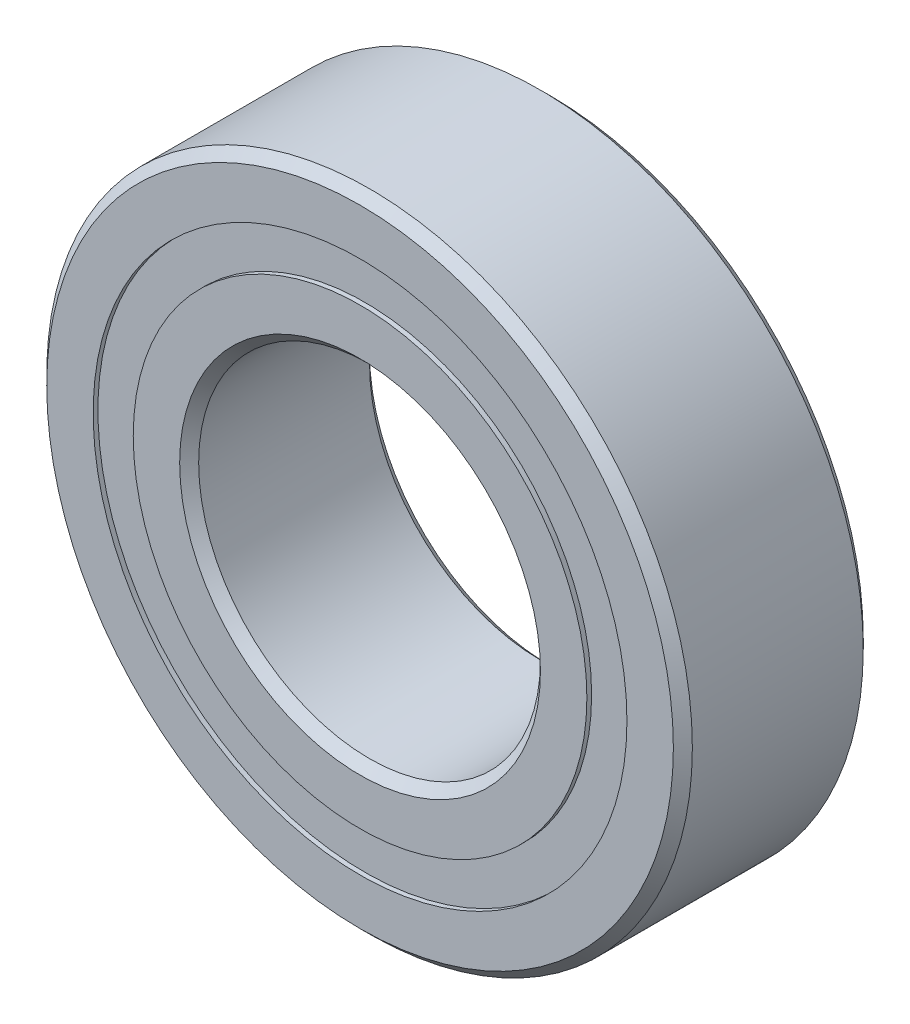
ISO-10303-21;
HEADER;
FILE_DESCRIPTION(('STEP AP214'),'2;1');
FILE_NAME('part.step','',(''),(''),'','','');
FILE_SCHEMA(('AUTOMOTIVE_DESIGN { 1 0 10303 214 1 1 1 1 }'));
ENDSEC;
DATA;
#1=APPLICATION_CONTEXT('core data for automotive mechanical design processes');
#2=APPLICATION_PROTOCOL_DEFINITION('international standard','automotive_design',2000,#1);
#3=PRODUCT_CONTEXT('',#1,'mechanical');
#4=PRODUCT('Part','Part','',(#3));
#5=PRODUCT_RELATED_PRODUCT_CATEGORY('part','',(#4));
#6=PRODUCT_DEFINITION_FORMATION('','',#4);
#7=PRODUCT_DEFINITION_CONTEXT('part definition',#1,'design');
#8=PRODUCT_DEFINITION('design','',#6,#7);
#9=PRODUCT_DEFINITION_SHAPE('','',#8);
#10=(LENGTH_UNIT() NAMED_UNIT(*) SI_UNIT(.MILLI.,.METRE.));
#11=(NAMED_UNIT(*) PLANE_ANGLE_UNIT() SI_UNIT($,.RADIAN.));
#12=(NAMED_UNIT(*) SI_UNIT($,.STERADIAN.) SOLID_ANGLE_UNIT());
#13=UNCERTAINTY_MEASURE_WITH_UNIT(LENGTH_MEASURE(1.E-05),#10,'distance_accuracy_value','');
#14=(GEOMETRIC_REPRESENTATION_CONTEXT(3) GLOBAL_UNCERTAINTY_ASSIGNED_CONTEXT((#13)) GLOBAL_UNIT_ASSIGNED_CONTEXT((#10,
#11,#12)) REPRESENTATION_CONTEXT('',''));
#15=CARTESIAN_POINT('',(0.,0.,0.));
#16=DIRECTION('',(0.,0.,1.));
#17=DIRECTION('',(1.,0.,0.));
#18=AXIS2_PLACEMENT_3D('',#15,#16,#17);
#19=CARTESIAN_POINT('',(0.,7.02747252747253,-2.375));
#20=DIRECTION('',(0.,0.,1.));
#21=DIRECTION('',(1.,0.,0.));
#22=AXIS2_PLACEMENT_3D('',#19,#20,#21);
#23=PLANE('',#22);
#24=CARTESIAN_POINT('',(0.,0.,-2.375));
#25=DIRECTION('',(0.,0.,1.));
#26=DIRECTION('',(1.,0.,0.));
#27=AXIS2_PLACEMENT_3D('',#24,#25,#26);
#28=CIRCLE('',#27,7.02747252747253);
#29=CARTESIAN_POINT('',(7.02747252747253,0.,-2.375));
#30=VERTEX_POINT('',#29);
#31=EDGE_CURVE('E59',#30,#30,#28,.T.);
#32=ORIENTED_EDGE('',*,*,#31,.F.);
#33=EDGE_LOOP('',(#32));
#34=FACE_BOUND('',#33,.T.);
#35=CARTESIAN_POINT('',(0.,0.,-2.375));
#36=DIRECTION('',(0.,0.,1.));
#37=DIRECTION('',(1.,0.,0.));
#38=AXIS2_PLACEMENT_3D('',#35,#36,#37);
#39=CIRCLE('',#38,5.97252747252748);
#40=CARTESIAN_POINT('',(5.97252747252748,0.,-2.375));
#41=VERTEX_POINT('',#40);
#42=EDGE_CURVE('E11',#41,#41,#39,.T.);
#43=ORIENTED_EDGE('',*,*,#42,.T.);
#44=EDGE_LOOP('',(#43));
#45=FACE_BOUND('',#44,.T.);
#46=ADVANCED_FACE('F45',(#34,#45),#23,.F.);
#47=CARTESIAN_POINT('',(0.,0.,2.5));
#48=DIRECTION('',(0.,0.,1.));
#49=DIRECTION('',(1.,0.,0.));
#50=AXIS2_PLACEMENT_3D('',#47,#48,#49);
#51=CYLINDRICAL_SURFACE('',#50,5.97252747252747);
#52=ORIENTED_EDGE('',*,*,#42,.F.);
#53=EDGE_LOOP('',(#52));
#54=FACE_BOUND('',#53,.T.);
#55=CARTESIAN_POINT('',(0.,0.,-1.22995738481983));
#56=DIRECTION('',(0.,0.,1.));
#57=DIRECTION('',(1.,0.,0.));
#58=AXIS2_PLACEMENT_3D('',#55,#56,#57);
#59=CIRCLE('',#58,5.97252747252747);
#60=CARTESIAN_POINT('',(5.97252747252747,0.,-1.22995738481983));
#61=VERTEX_POINT('',#60);
#62=EDGE_CURVE('E51',#61,#61,#59,.T.);
#63=ORIENTED_EDGE('',*,*,#62,.T.);
#64=EDGE_LOOP('',(#63));
#65=FACE_BOUND('',#64,.T.);
#66=ADVANCED_FACE('F68',(#54,#65),#51,.F.);
#67=CARTESIAN_POINT('',(0.,7.02747252747253,-1.22995738481983));
#68=DIRECTION('',(0.,0.,-1.));
#69=DIRECTION('',(-1.,0.,0.));
#70=AXIS2_PLACEMENT_3D('',#67,#68,#69);
#71=PLANE('',#70);
#72=ORIENTED_EDGE('',*,*,#62,.F.);
#73=EDGE_LOOP('',(#72));
#74=FACE_BOUND('',#73,.T.);
#75=CARTESIAN_POINT('',(0.,0.,-1.22995738481983));
#76=DIRECTION('',(0.,0.,1.));
#77=DIRECTION('',(1.,0.,0.));
#78=AXIS2_PLACEMENT_3D('',#75,#76,#77);
#79=CIRCLE('',#78,7.02747252747253);
#80=CARTESIAN_POINT('',(7.02747252747253,0.,-1.22995738481983));
#81=VERTEX_POINT('',#80);
#82=EDGE_CURVE('E55',#81,#81,#79,.T.);
#83=ORIENTED_EDGE('',*,*,#82,.T.);
#84=EDGE_LOOP('',(#83));
#85=FACE_BOUND('',#84,.T.);
#86=ADVANCED_FACE('F72',(#74,#85),#71,.F.);
#87=CARTESIAN_POINT('',(0.,0.,2.5));
#88=DIRECTION('',(0.,0.,1.));
#89=DIRECTION('',(1.,0.,0.));
#90=AXIS2_PLACEMENT_3D('',#87,#88,#89);
#91=CYLINDRICAL_SURFACE('',#90,7.02747252747253);
#92=ORIENTED_EDGE('',*,*,#82,.F.);
#93=EDGE_LOOP('',(#92));
#94=FACE_BOUND('',#93,.T.);
#95=ORIENTED_EDGE('',*,*,#31,.T.);
#96=EDGE_LOOP('',(#95));
#97=FACE_BOUND('',#96,.T.);
#98=ADVANCED_FACE('F65',(#94,#97),#91,.T.);
#99=CLOSED_SHELL('',(#46,#66,#86,#98));
#100=MANIFOLD_SOLID_BREP('B2',#99);
#101=CARTESIAN_POINT('',(0.,7.02747252747253,2.375));
#102=DIRECTION('',(0.,0.,-1.));
#103=DIRECTION('',(-1.,0.,0.));
#104=AXIS2_PLACEMENT_3D('',#101,#102,#103);
#105=PLANE('',#104);
#106=CARTESIAN_POINT('',(0.,0.,2.375));
#107=DIRECTION('',(0.,0.,1.));
#108=DIRECTION('',(1.,0.,0.));
#109=AXIS2_PLACEMENT_3D('',#106,#107,#108);
#110=CIRCLE('',#109,5.97252747252747);
#111=CARTESIAN_POINT('',(5.97252747252747,0.,2.375));
#112=VERTEX_POINT('',#111);
#113=EDGE_CURVE('E44',#112,#112,#110,.T.);
#114=ORIENTED_EDGE('',*,*,#113,.F.);
#115=EDGE_LOOP('',(#114));
#116=FACE_BOUND('',#115,.T.);
#117=CARTESIAN_POINT('',(0.,0.,2.375));
#118=DIRECTION('',(0.,0.,1.));
#119=DIRECTION('',(1.,0.,0.));
#120=AXIS2_PLACEMENT_3D('',#117,#118,#119);
#121=CIRCLE('',#120,7.02747252747253);
#122=CARTESIAN_POINT('',(7.02747252747253,0.,2.375));
#123=VERTEX_POINT('',#122);
#124=EDGE_CURVE('E134',#123,#123,#121,.T.);
#125=ORIENTED_EDGE('',*,*,#124,.T.);
#126=EDGE_LOOP('',(#125));
#127=FACE_BOUND('',#126,.T.);
#128=ADVANCED_FACE('F120',(#116,#127),#105,.F.);
#129=CARTESIAN_POINT('',(0.,0.,2.5));
#130=DIRECTION('',(0.,0.,1.));
#131=DIRECTION('',(1.,0.,0.));
#132=AXIS2_PLACEMENT_3D('',#129,#130,#131);
#133=CYLINDRICAL_SURFACE('',#132,5.97252747252747);
#134=CARTESIAN_POINT('',(0.,0.,1.22995738481983));
#135=DIRECTION('',(0.,0.,1.));
#136=DIRECTION('',(1.,0.,0.));
#137=AXIS2_PLACEMENT_3D('',#134,#135,#136);
#138=CIRCLE('',#137,5.97252747252747);
#139=CARTESIAN_POINT('',(5.97252747252747,0.,1.22995738481983));
#140=VERTEX_POINT('',#139);
#141=EDGE_CURVE('E126',#140,#140,#138,.T.);
#142=ORIENTED_EDGE('',*,*,#141,.F.);
#143=EDGE_LOOP('',(#142));
#144=FACE_BOUND('',#143,.T.);
#145=ORIENTED_EDGE('',*,*,#113,.T.);
#146=EDGE_LOOP('',(#145));
#147=FACE_BOUND('',#146,.T.);
#148=ADVANCED_FACE('F149',(#144,#147),#133,.F.);
#149=CARTESIAN_POINT('',(0.,7.02747252747253,1.22995738481983));
#150=DIRECTION('',(0.,0.,1.));
#151=DIRECTION('',(1.,0.,0.));
#152=AXIS2_PLACEMENT_3D('',#149,#150,#151);
#153=PLANE('',#152);
#154=CARTESIAN_POINT('',(0.,0.,1.22995738481983));
#155=DIRECTION('',(0.,0.,1.));
#156=DIRECTION('',(1.,0.,0.));
#157=AXIS2_PLACEMENT_3D('',#154,#155,#156);
#158=CIRCLE('',#157,7.02747252747253);
#159=CARTESIAN_POINT('',(7.02747252747253,0.,1.22995738481983));
#160=VERTEX_POINT('',#159);
#161=EDGE_CURVE('E130',#160,#160,#158,.T.);
#162=ORIENTED_EDGE('',*,*,#161,.F.);
#163=EDGE_LOOP('',(#162));
#164=FACE_BOUND('',#163,.T.);
#165=ORIENTED_EDGE('',*,*,#141,.T.);
#166=EDGE_LOOP('',(#165));
#167=FACE_BOUND('',#166,.T.);
#168=ADVANCED_FACE('F144',(#164,#167),#153,.F.);
#169=CARTESIAN_POINT('',(0.,0.,2.5));
#170=DIRECTION('',(0.,0.,1.));
#171=DIRECTION('',(1.,0.,0.));
#172=AXIS2_PLACEMENT_3D('',#169,#170,#171);
#173=CYLINDRICAL_SURFACE('',#172,7.02747252747253);
#174=ORIENTED_EDGE('',*,*,#124,.F.);
#175=EDGE_LOOP('',(#174));
#176=FACE_BOUND('',#175,.T.);
#177=ORIENTED_EDGE('',*,*,#161,.T.);
#178=EDGE_LOOP('',(#177));
#179=FACE_BOUND('',#178,.T.);
#180=ADVANCED_FACE('F141',(#176,#179),#173,.T.);
#181=CLOSED_SHELL('',(#128,#148,#168,#180));
#182=MANIFOLD_SOLID_BREP('B6',#181);
#183=CARTESIAN_POINT('',(-3.24999999999993,5.62916512459889,0.));
#184=DIRECTION('',(0.,0.,1.));
#185=DIRECTION('',(-0.499999999999989,0.866025403784445,0.));
#186=AXIS2_PLACEMENT_3D('',#183,#184,#185);
#187=SPHERICAL_SURFACE('',#186,1.22995738481983);
#188=CARTESIAN_POINT('',(-3.24999999999993,5.62916512459889,1.22995738481983));
#189=VERTEX_POINT('',#188);
#190=VERTEX_LOOP('',#189);
#191=FACE_BOUND('',#190,.T.);
#192=ADVANCED_FACE('F195',(#191),#187,.T.);
#193=CLOSED_SHELL('',(#192));
#194=MANIFOLD_SOLID_BREP('B39',#193);
#195=CARTESIAN_POINT('',(-5.62916512459881,3.25000000000007,0.));
#196=DIRECTION('',(0.,0.,1.));
#197=DIRECTION('',(-0.866025403784433,0.50000000000001,0.));
#198=AXIS2_PLACEMENT_3D('',#195,#196,#197);
#199=SPHERICAL_SURFACE('',#198,1.22995738481983);
#200=CARTESIAN_POINT('',(-5.62916512459881,3.25000000000007,1.22995738481983));
#201=VERTEX_POINT('',#200);
#202=VERTEX_LOOP('',#201);
#203=FACE_BOUND('',#202,.T.);
#204=ADVANCED_FACE('F217',(#203),#199,.T.);
#205=CLOSED_SHELL('',(#204));
#206=MANIFOLD_SOLID_BREP('B116',#205);
#207=CARTESIAN_POINT('',(-6.5,0.,0.));
#208=DIRECTION('',(0.,0.,1.));
#209=DIRECTION('',(-1.,0.,0.));
#210=AXIS2_PLACEMENT_3D('',#207,#208,#209);
#211=SPHERICAL_SURFACE('',#210,1.22995738481983);
#212=CARTESIAN_POINT('',(-6.5,0.,1.22995738481983));
#213=VERTEX_POINT('',#212);
#214=VERTEX_LOOP('',#213);
#215=FACE_BOUND('',#214,.T.);
#216=ADVANCED_FACE('F239',(#215),#211,.T.);
#217=CLOSED_SHELL('',(#216));
#218=MANIFOLD_SOLID_BREP('B191',#217);
#219=CARTESIAN_POINT('',(-5.62916512459888,-3.24999999999995,0.));
#220=DIRECTION('',(0.,0.,1.));
#221=DIRECTION('',(-0.866025403784443,-0.499999999999992,0.));
#222=AXIS2_PLACEMENT_3D('',#219,#220,#221);
#223=SPHERICAL_SURFACE('',#222,1.22995738481983);
#224=CARTESIAN_POINT('',(-5.62916512459888,-3.24999999999995,1.22995738481983));
#225=VERTEX_POINT('',#224);
#226=VERTEX_LOOP('',#225);
#227=FACE_BOUND('',#226,.T.);
#228=ADVANCED_FACE('F261',(#227),#223,.T.);
#229=CLOSED_SHELL('',(#228));
#230=MANIFOLD_SOLID_BREP('B213',#229);
#231=CARTESIAN_POINT('',(-3.25000000000005,-5.62916512459883,0.));
#232=DIRECTION('',(0.,0.,1.));
#233=DIRECTION('',(-0.500000000000007,-0.866025403784435,0.));
#234=AXIS2_PLACEMENT_3D('',#231,#232,#233);
#235=SPHERICAL_SURFACE('',#234,1.22995738481983);
#236=CARTESIAN_POINT('',(-3.25000000000005,-5.62916512459883,1.22995738481983));
#237=VERTEX_POINT('',#236);
#238=VERTEX_LOOP('',#237);
#239=FACE_BOUND('',#238,.T.);
#240=ADVANCED_FACE('F283',(#239),#235,.T.);
#241=CLOSED_SHELL('',(#240));
#242=MANIFOLD_SOLID_BREP('B235',#241);
#243=CARTESIAN_POINT('',(0.,-6.5,0.));
#244=DIRECTION('',(0.,0.,1.));
#245=DIRECTION('',(0.,-1.,0.));
#246=AXIS2_PLACEMENT_3D('',#243,#244,#245);
#247=SPHERICAL_SURFACE('',#246,1.22995738481983);
#248=CARTESIAN_POINT('',(0.,-6.5,1.22995738481983));
#249=VERTEX_POINT('',#248);
#250=VERTEX_LOOP('',#249);
#251=FACE_BOUND('',#250,.T.);
#252=ADVANCED_FACE('F305',(#251),#247,.T.);
#253=CLOSED_SHELL('',(#252));
#254=MANIFOLD_SOLID_BREP('B257',#253);
#255=CARTESIAN_POINT('',(3.24999999999997,-5.62916512459887,0.));
#256=DIRECTION('',(0.,0.,1.));
#257=DIRECTION('',(0.499999999999995,-0.866025403784442,0.));
#258=AXIS2_PLACEMENT_3D('',#255,#256,#257);
#259=SPHERICAL_SURFACE('',#258,1.22995738481983);
#260=CARTESIAN_POINT('',(3.24999999999997,-5.62916512459887,1.22995738481983));
#261=VERTEX_POINT('',#260);
#262=VERTEX_LOOP('',#261);
#263=FACE_BOUND('',#262,.T.);
#264=ADVANCED_FACE('F327',(#263),#259,.T.);
#265=CLOSED_SHELL('',(#264));
#266=MANIFOLD_SOLID_BREP('B279',#265);
#267=CARTESIAN_POINT('',(5.62916512459884,-3.25000000000003,0.));
#268=DIRECTION('',(0.,0.,1.));
#269=DIRECTION('',(0.866025403784436,-0.500000000000004,0.));
#270=AXIS2_PLACEMENT_3D('',#267,#268,#269);
#271=SPHERICAL_SURFACE('',#270,1.22995738481983);
#272=CARTESIAN_POINT('',(5.62916512459884,-3.25000000000003,1.22995738481983));
#273=VERTEX_POINT('',#272);
#274=VERTEX_LOOP('',#273);
#275=FACE_BOUND('',#274,.T.);
#276=ADVANCED_FACE('F349',(#275),#271,.T.);
#277=CLOSED_SHELL('',(#276));
#278=MANIFOLD_SOLID_BREP('B301',#277);
#279=CARTESIAN_POINT('',(6.5,0.,0.));
#280=DIRECTION('',(0.,0.,1.));
#281=DIRECTION('',(1.,0.,0.));
#282=AXIS2_PLACEMENT_3D('',#279,#280,#281);
#283=SPHERICAL_SURFACE('',#282,1.22995738481983);
#284=CARTESIAN_POINT('',(6.5,0.,1.22995738481983));
#285=VERTEX_POINT('',#284);
#286=VERTEX_LOOP('',#285);
#287=FACE_BOUND('',#286,.T.);
#288=ADVANCED_FACE('F371',(#287),#283,.T.);
#289=CLOSED_SHELL('',(#288));
#290=MANIFOLD_SOLID_BREP('B323',#289);
#291=CARTESIAN_POINT('',(5.62916512459886,3.24999999999999,0.));
#292=DIRECTION('',(0.,0.,1.));
#293=DIRECTION('',(0.86602540378444,0.499999999999998,0.));
#294=AXIS2_PLACEMENT_3D('',#291,#292,#293);
#295=SPHERICAL_SURFACE('',#294,1.22995738481983);
#296=CARTESIAN_POINT('',(5.62916512459886,3.24999999999999,1.22995738481983));
#297=VERTEX_POINT('',#296);
#298=VERTEX_LOOP('',#297);
#299=FACE_BOUND('',#298,.T.);
#300=ADVANCED_FACE('F393',(#299),#295,.T.);
#301=CLOSED_SHELL('',(#300));
#302=MANIFOLD_SOLID_BREP('B345',#301);
#303=CARTESIAN_POINT('',(3.25000000000001,5.62916512459885,0.));
#304=DIRECTION('',(0.,0.,1.));
#305=DIRECTION('',(0.500000000000001,0.866025403784438,0.));
#306=AXIS2_PLACEMENT_3D('',#303,#304,#305);
#307=SPHERICAL_SURFACE('',#306,1.22995738481983);
#308=CARTESIAN_POINT('',(3.25000000000001,5.62916512459885,1.22995738481983));
#309=VERTEX_POINT('',#308);
#310=VERTEX_LOOP('',#309);
#311=FACE_BOUND('',#310,.T.);
#312=ADVANCED_FACE('F415',(#311),#307,.T.);
#313=CLOSED_SHELL('',(#312));
#314=MANIFOLD_SOLID_BREP('B367',#313);
#315=CARTESIAN_POINT('',(0.,6.5,0.));
#316=DIRECTION('',(0.,0.,1.));
#317=DIRECTION('',(0.,1.,0.));
#318=AXIS2_PLACEMENT_3D('',#315,#316,#317);
#319=SPHERICAL_SURFACE('',#318,1.22995738481983);
#320=CARTESIAN_POINT('',(0.,6.5,1.22995738481983));
#321=VERTEX_POINT('',#320);
#322=VERTEX_LOOP('',#321);
#323=FACE_BOUND('',#322,.T.);
#324=ADVANCED_FACE('F439',(#323),#319,.T.);
#325=CLOSED_SHELL('',(#324));
#326=MANIFOLD_SOLID_BREP('B389',#325);
#327=CARTESIAN_POINT('',(0.,5.97252747252747,2.5));
#328=DIRECTION('',(0.,0.,-1.));
#329=DIRECTION('',(-1.,0.,0.));
#330=AXIS2_PLACEMENT_3D('',#327,#328,#329);
#331=PLANE('',#330);
#332=CARTESIAN_POINT('',(0.,0.,2.5));
#333=DIRECTION('',(0.,0.,1.));
#334=DIRECTION('',(1.,0.,0.));
#335=AXIS2_PLACEMENT_3D('',#332,#333,#334);
#336=CIRCLE('',#335,4.75);
#337=CARTESIAN_POINT('',(4.75,0.,2.5));
#338=VERTEX_POINT('',#337);
#339=EDGE_CURVE('E488',#338,#338,#336,.T.);
#340=ORIENTED_EDGE('',*,*,#339,.F.);
#341=EDGE_LOOP('',(#340));
#342=FACE_BOUND('',#341,.T.);
#343=CARTESIAN_POINT('',(0.,0.,2.5));
#344=DIRECTION('',(0.,0.,1.));
#345=DIRECTION('',(1.,0.,0.));
#346=AXIS2_PLACEMENT_3D('',#343,#344,#345);
#347=CIRCLE('',#346,5.97252747252747);
#348=CARTESIAN_POINT('',(5.97252747252747,0.,2.5));
#349=VERTEX_POINT('',#348);
#350=EDGE_CURVE('E438',#349,#349,#347,.T.);
#351=ORIENTED_EDGE('',*,*,#350,.T.);
#352=EDGE_LOOP('',(#351));
#353=FACE_BOUND('',#352,.T.);
#354=ADVANCED_FACE('F460',(#342,#353),#331,.F.);
#355=CARTESIAN_POINT('',(0.,0.,2.5));
#356=DIRECTION('',(0.,0.,1.));
#357=DIRECTION('',(1.,0.,0.));
#358=AXIS2_PLACEMENT_3D('',#355,#356,#357);
#359=CYLINDRICAL_SURFACE('',#358,5.97252747252747);
#360=ORIENTED_EDGE('',*,*,#350,.F.);
#361=EDGE_LOOP('',(#360));
#362=FACE_BOUND('',#361,.T.);
#363=CARTESIAN_POINT('',(0.,0.,1.11111111111111));
#364=DIRECTION('',(0.,0.,1.));
#365=DIRECTION('',(1.,0.,0.));
#366=AXIS2_PLACEMENT_3D('',#363,#364,#365);
#367=CIRCLE('',#366,5.97252747252747);
#368=CARTESIAN_POINT('',(5.97252747252747,0.,1.11111111111111));
#369=VERTEX_POINT('',#368);
#370=EDGE_CURVE('E466',#369,#369,#367,.T.);
#371=ORIENTED_EDGE('',*,*,#370,.T.);
#372=EDGE_LOOP('',(#371));
#373=FACE_BOUND('',#372,.T.);
#374=ADVANCED_FACE('F495',(#362,#373),#359,.T.);
#375=CARTESIAN_POINT('',(0.,0.,0.));
#376=DIRECTION('',(0.,0.,1.));
#377=DIRECTION('',(1.,0.,0.));
#378=AXIS2_PLACEMENT_3D('',#375,#376,#377);
#379=TOROIDAL_SURFACE('',#378,6.5,1.22995738481982);
#380=ORIENTED_EDGE('',*,*,#370,.F.);
#381=EDGE_LOOP('',(#380));
#382=FACE_BOUND('',#381,.T.);
#383=CARTESIAN_POINT('',(0.,0.,-1.11111111111111));
#384=DIRECTION('',(0.,0.,1.));
#385=DIRECTION('',(1.,0.,0.));
#386=AXIS2_PLACEMENT_3D('',#383,#384,#385);
#387=CIRCLE('',#386,5.97252747252747);
#388=CARTESIAN_POINT('',(5.97252747252747,0.,-1.11111111111111));
#389=VERTEX_POINT('',#388);
#390=EDGE_CURVE('E470',#389,#389,#387,.T.);
#391=ORIENTED_EDGE('',*,*,#390,.T.);
#392=EDGE_LOOP('',(#391));
#393=FACE_BOUND('',#392,.T.);
#394=ADVANCED_FACE('F499',(#382,#393),#379,.F.);
#395=CARTESIAN_POINT('',(0.,0.,2.5));
#396=DIRECTION('',(0.,0.,1.));
#397=DIRECTION('',(1.,0.,0.));
#398=AXIS2_PLACEMENT_3D('',#395,#396,#397);
#399=CYLINDRICAL_SURFACE('',#398,5.97252747252747);
#400=ORIENTED_EDGE('',*,*,#390,.F.);
#401=EDGE_LOOP('',(#400));
#402=FACE_BOUND('',#401,.T.);
#403=CARTESIAN_POINT('',(0.,0.,-2.5));
#404=DIRECTION('',(0.,0.,1.));
#405=DIRECTION('',(1.,0.,0.));
#406=AXIS2_PLACEMENT_3D('',#403,#404,#405);
#407=CIRCLE('',#406,5.97252747252747);
#408=CARTESIAN_POINT('',(5.97252747252747,0.,-2.5));
#409=VERTEX_POINT('',#408);
#410=EDGE_CURVE('E474',#409,#409,#407,.T.);
#411=ORIENTED_EDGE('',*,*,#410,.T.);
#412=EDGE_LOOP('',(#411));
#413=FACE_BOUND('',#412,.T.);
#414=ADVANCED_FACE('F504',(#402,#413),#399,.T.);
#415=CARTESIAN_POINT('',(0.,4.75,-2.5));
#416=DIRECTION('',(0.,0.,1.));
#417=DIRECTION('',(1.,0.,0.));
#418=AXIS2_PLACEMENT_3D('',#415,#416,#417);
#419=PLANE('',#418);
#420=ORIENTED_EDGE('',*,*,#410,.F.);
#421=EDGE_LOOP('',(#420));
#422=FACE_BOUND('',#421,.T.);
#423=CARTESIAN_POINT('',(0.,0.,-2.5));
#424=DIRECTION('',(0.,0.,1.));
#425=DIRECTION('',(1.,0.,0.));
#426=AXIS2_PLACEMENT_3D('',#423,#424,#425);
#427=CIRCLE('',#426,4.75);
#428=CARTESIAN_POINT('',(4.75,0.,-2.5));
#429=VERTEX_POINT('',#428);
#430=EDGE_CURVE('E479',#429,#429,#427,.T.);
#431=ORIENTED_EDGE('',*,*,#430,.T.);
#432=EDGE_LOOP('',(#431));
#433=FACE_BOUND('',#432,.T.);
#434=ADVANCED_FACE('F510',(#422,#433),#419,.F.);
#435=CARTESIAN_POINT('',(0.,0.,-2.25));
#436=DIRECTION('',(0.,0.,-1.));
#437=DIRECTION('',(-1.,0.,0.));
#438=AXIS2_PLACEMENT_3D('',#435,#436,#437);
#439=CONICAL_SURFACE('',#438,4.5,0.785398163397445);
#440=ORIENTED_EDGE('',*,*,#430,.F.);
#441=EDGE_LOOP('',(#440));
#442=FACE_BOUND('',#441,.T.);
#443=CARTESIAN_POINT('',(0.,0.,-2.25));
#444=DIRECTION('',(0.,0.,1.));
#445=DIRECTION('',(1.,0.,0.));
#446=AXIS2_PLACEMENT_3D('',#443,#444,#445);
#447=CIRCLE('',#446,4.5);
#448=CARTESIAN_POINT('',(4.5,0.,-2.25));
#449=VERTEX_POINT('',#448);
#450=EDGE_CURVE('E482',#449,#449,#447,.T.);
#451=ORIENTED_EDGE('',*,*,#450,.T.);
#452=EDGE_LOOP('',(#451));
#453=FACE_BOUND('',#452,.T.);
#454=ADVANCED_FACE('F514',(#442,#453),#439,.F.);
#455=CARTESIAN_POINT('',(0.,0.,2.5));
#456=DIRECTION('',(0.,0.,1.));
#457=DIRECTION('',(1.,0.,0.));
#458=AXIS2_PLACEMENT_3D('',#455,#456,#457);
#459=CYLINDRICAL_SURFACE('',#458,4.5);
#460=ORIENTED_EDGE('',*,*,#450,.F.);
#461=EDGE_LOOP('',(#460));
#462=FACE_BOUND('',#461,.T.);
#463=CARTESIAN_POINT('',(0.,0.,2.25));
#464=DIRECTION('',(0.,0.,1.));
#465=DIRECTION('',(1.,0.,0.));
#466=AXIS2_PLACEMENT_3D('',#463,#464,#465);
#467=CIRCLE('',#466,4.5);
#468=CARTESIAN_POINT('',(4.5,0.,2.25));
#469=VERTEX_POINT('',#468);
#470=EDGE_CURVE('E485',#469,#469,#467,.T.);
#471=ORIENTED_EDGE('',*,*,#470,.T.);
#472=EDGE_LOOP('',(#471));
#473=FACE_BOUND('',#472,.T.);
#474=ADVANCED_FACE('F518',(#462,#473),#459,.F.);
#475=CARTESIAN_POINT('',(0.,0.,2.5));
#476=DIRECTION('',(0.,0.,1.));
#477=DIRECTION('',(1.,0.,0.));
#478=AXIS2_PLACEMENT_3D('',#475,#476,#477);
#479=CONICAL_SURFACE('',#478,4.75,0.785398163397452);
#480=ORIENTED_EDGE('',*,*,#470,.F.);
#481=EDGE_LOOP('',(#480));
#482=FACE_BOUND('',#481,.T.);
#483=ORIENTED_EDGE('',*,*,#339,.T.);
#484=EDGE_LOOP('',(#483));
#485=FACE_BOUND('',#484,.T.);
#486=ADVANCED_FACE('F492',(#482,#485),#479,.F.);
#487=CLOSED_SHELL('',(#354,#374,#394,#414,#434,#454,#474,#486));
#488=MANIFOLD_SOLID_BREP('B411',#487);
#489=CARTESIAN_POINT('',(0.,0.,2.25));
#490=DIRECTION('',(0.,0.,-1.));
#491=DIRECTION('',(-1.,0.,0.));
#492=AXIS2_PLACEMENT_3D('',#489,#490,#491);
#493=CONICAL_SURFACE('',#492,8.5,0.785398163397445);
#494=CARTESIAN_POINT('',(0.,0.,2.5));
#495=DIRECTION('',(0.,0.,1.));
#496=DIRECTION('',(1.,0.,0.));
#497=AXIS2_PLACEMENT_3D('',#494,#495,#496);
#498=CIRCLE('',#497,8.25);
#499=CARTESIAN_POINT('',(8.25,0.,2.5));
#500=VERTEX_POINT('',#499);
#501=EDGE_CURVE('E625',#500,#500,#498,.T.);
#502=ORIENTED_EDGE('',*,*,#501,.F.);
#503=EDGE_LOOP('',(#502));
#504=FACE_BOUND('',#503,.T.);
#505=CARTESIAN_POINT('',(0.,0.,2.25));
#506=DIRECTION('',(0.,0.,1.));
#507=DIRECTION('',(1.,0.,0.));
#508=AXIS2_PLACEMENT_3D('',#505,#506,#507);
#509=CIRCLE('',#508,8.5);
#510=CARTESIAN_POINT('',(8.5,0.,2.25));
#511=VERTEX_POINT('',#510);
#512=EDGE_CURVE('E459',#511,#511,#509,.T.);
#513=ORIENTED_EDGE('',*,*,#512,.T.);
#514=EDGE_LOOP('',(#513));
#515=FACE_BOUND('',#514,.T.);
#516=ADVANCED_FACE('F597',(#504,#515),#493,.T.);
#517=CARTESIAN_POINT('',(0.,0.,2.5));
#518=DIRECTION('',(0.,0.,1.));
#519=DIRECTION('',(1.,0.,0.));
#520=AXIS2_PLACEMENT_3D('',#517,#518,#519);
#521=CYLINDRICAL_SURFACE('',#520,8.5);
#522=ORIENTED_EDGE('',*,*,#512,.F.);
#523=EDGE_LOOP('',(#522));
#524=FACE_BOUND('',#523,.T.);
#525=CARTESIAN_POINT('',(0.,0.,-2.25));
#526=DIRECTION('',(0.,0.,1.));
#527=DIRECTION('',(1.,0.,0.));
#528=AXIS2_PLACEMENT_3D('',#525,#526,#527);
#529=CIRCLE('',#528,8.5);
#530=CARTESIAN_POINT('',(8.5,0.,-2.25));
#531=VERTEX_POINT('',#530);
#532=EDGE_CURVE('E603',#531,#531,#529,.T.);
#533=ORIENTED_EDGE('',*,*,#532,.T.);
#534=EDGE_LOOP('',(#533));
#535=FACE_BOUND('',#534,.T.);
#536=ADVANCED_FACE('F632',(#524,#535),#521,.T.);
#537=CARTESIAN_POINT('',(0.,0.,-2.5));
#538=DIRECTION('',(0.,0.,1.));
#539=DIRECTION('',(1.,0.,0.));
#540=AXIS2_PLACEMENT_3D('',#537,#538,#539);
#541=CONICAL_SURFACE('',#540,8.25,0.785398163397445);
#542=ORIENTED_EDGE('',*,*,#532,.F.);
#543=EDGE_LOOP('',(#542));
#544=FACE_BOUND('',#543,.T.);
#545=CARTESIAN_POINT('',(0.,0.,-2.5));
#546=DIRECTION('',(0.,0.,1.));
#547=DIRECTION('',(1.,0.,0.));
#548=AXIS2_PLACEMENT_3D('',#545,#546,#547);
#549=CIRCLE('',#548,8.25);
#550=CARTESIAN_POINT('',(8.25,0.,-2.5));
#551=VERTEX_POINT('',#550);
#552=EDGE_CURVE('E607',#551,#551,#549,.T.);
#553=ORIENTED_EDGE('',*,*,#552,.T.);
#554=EDGE_LOOP('',(#553));
#555=FACE_BOUND('',#554,.T.);
#556=ADVANCED_FACE('F636',(#544,#555),#541,.T.);
#557=CARTESIAN_POINT('',(0.,8.25,-2.5));
#558=DIRECTION('',(0.,0.,1.));
#559=DIRECTION('',(1.,0.,0.));
#560=AXIS2_PLACEMENT_3D('',#557,#558,#559);
#561=PLANE('',#560);
#562=ORIENTED_EDGE('',*,*,#552,.F.);
#563=EDGE_LOOP('',(#562));
#564=FACE_BOUND('',#563,.T.);
#565=CARTESIAN_POINT('',(0.,0.,-2.5));
#566=DIRECTION('',(0.,0.,1.));
#567=DIRECTION('',(1.,0.,0.));
#568=AXIS2_PLACEMENT_3D('',#565,#566,#567);
#569=CIRCLE('',#568,7.02747252747253);
#570=CARTESIAN_POINT('',(7.02747252747253,0.,-2.5));
#571=VERTEX_POINT('',#570);
#572=EDGE_CURVE('E611',#571,#571,#569,.T.);
#573=ORIENTED_EDGE('',*,*,#572,.T.);
#574=EDGE_LOOP('',(#573));
#575=FACE_BOUND('',#574,.T.);
#576=ADVANCED_FACE('F641',(#564,#575),#561,.F.);
#577=CARTESIAN_POINT('',(0.,0.,2.5));
#578=DIRECTION('',(0.,0.,1.));
#579=DIRECTION('',(1.,0.,0.));
#580=AXIS2_PLACEMENT_3D('',#577,#578,#579);
#581=CYLINDRICAL_SURFACE('',#580,7.02747252747253);
#582=ORIENTED_EDGE('',*,*,#572,.F.);
#583=EDGE_LOOP('',(#582));
#584=FACE_BOUND('',#583,.T.);
#585=CARTESIAN_POINT('',(0.,0.,-1.11111111111111));
#586=DIRECTION('',(0.,0.,1.));
#587=DIRECTION('',(1.,0.,0.));
#588=AXIS2_PLACEMENT_3D('',#585,#586,#587);
#589=CIRCLE('',#588,7.02747252747253);
#590=CARTESIAN_POINT('',(7.02747252747253,0.,-1.11111111111111));
#591=VERTEX_POINT('',#590);
#592=EDGE_CURVE('E616',#591,#591,#589,.T.);
#593=ORIENTED_EDGE('',*,*,#592,.T.);
#594=EDGE_LOOP('',(#593));
#595=FACE_BOUND('',#594,.T.);
#596=ADVANCED_FACE('F647',(#584,#595),#581,.F.);
#597=CARTESIAN_POINT('',(0.,0.,0.));
#598=DIRECTION('',(0.,0.,1.));
#599=DIRECTION('',(1.,0.,0.));
#600=AXIS2_PLACEMENT_3D('',#597,#598,#599);
#601=TOROIDAL_SURFACE('',#600,6.5,1.22995738481983);
#602=ORIENTED_EDGE('',*,*,#592,.F.);
#603=EDGE_LOOP('',(#602));
#604=FACE_BOUND('',#603,.T.);
#605=CARTESIAN_POINT('',(0.,0.,1.11111111111111));
#606=DIRECTION('',(0.,0.,1.));
#607=DIRECTION('',(1.,0.,0.));
#608=AXIS2_PLACEMENT_3D('',#605,#606,#607);
#609=CIRCLE('',#608,7.02747252747253);
#610=CARTESIAN_POINT('',(7.02747252747253,0.,1.11111111111111));
#611=VERTEX_POINT('',#610);
#612=EDGE_CURVE('E619',#611,#611,#609,.T.);
#613=ORIENTED_EDGE('',*,*,#612,.T.);
#614=EDGE_LOOP('',(#613));
#615=FACE_BOUND('',#614,.T.);
#616=ADVANCED_FACE('F651',(#604,#615),#601,.F.);
#617=CARTESIAN_POINT('',(0.,0.,2.5));
#618=DIRECTION('',(0.,0.,1.));
#619=DIRECTION('',(1.,0.,0.));
#620=AXIS2_PLACEMENT_3D('',#617,#618,#619);
#621=CYLINDRICAL_SURFACE('',#620,7.02747252747253);
#622=ORIENTED_EDGE('',*,*,#612,.F.);
#623=EDGE_LOOP('',(#622));
#624=FACE_BOUND('',#623,.T.);
#625=CARTESIAN_POINT('',(0.,0.,2.5));
#626=DIRECTION('',(0.,0.,1.));
#627=DIRECTION('',(1.,0.,0.));
#628=AXIS2_PLACEMENT_3D('',#625,#626,#627);
#629=CIRCLE('',#628,7.02747252747253);
#630=CARTESIAN_POINT('',(7.02747252747253,0.,2.5));
#631=VERTEX_POINT('',#630);
#632=EDGE_CURVE('E622',#631,#631,#629,.T.);
#633=ORIENTED_EDGE('',*,*,#632,.T.);
#634=EDGE_LOOP('',(#633));
#635=FACE_BOUND('',#634,.T.);
#636=ADVANCED_FACE('F655',(#624,#635),#621,.F.);
#637=CARTESIAN_POINT('',(0.,8.25,2.5));
#638=DIRECTION('',(0.,0.,-1.));
#639=DIRECTION('',(-1.,0.,0.));
#640=AXIS2_PLACEMENT_3D('',#637,#638,#639);
#641=PLANE('',#640);
#642=ORIENTED_EDGE('',*,*,#632,.F.);
#643=EDGE_LOOP('',(#642));
#644=FACE_BOUND('',#643,.T.);
#645=ORIENTED_EDGE('',*,*,#501,.T.);
#646=EDGE_LOOP('',(#645));
#647=FACE_BOUND('',#646,.T.);
#648=ADVANCED_FACE('F629',(#644,#647),#641,.F.);
#649=CLOSED_SHELL('',(#516,#536,#556,#576,#596,#616,#636,#648));
#650=MANIFOLD_SOLID_BREP('B433',#649);
#651=ADVANCED_BREP_SHAPE_REPRESENTATION('',(#18,#100,#182,#194,#206,#218,#230,#242,#254,#266,
#278,#290,#302,#314,#326,#488,#650),#14);
#652=SHAPE_DEFINITION_REPRESENTATION(#9,#651);
ENDSEC;
END-ISO-10303-21;
